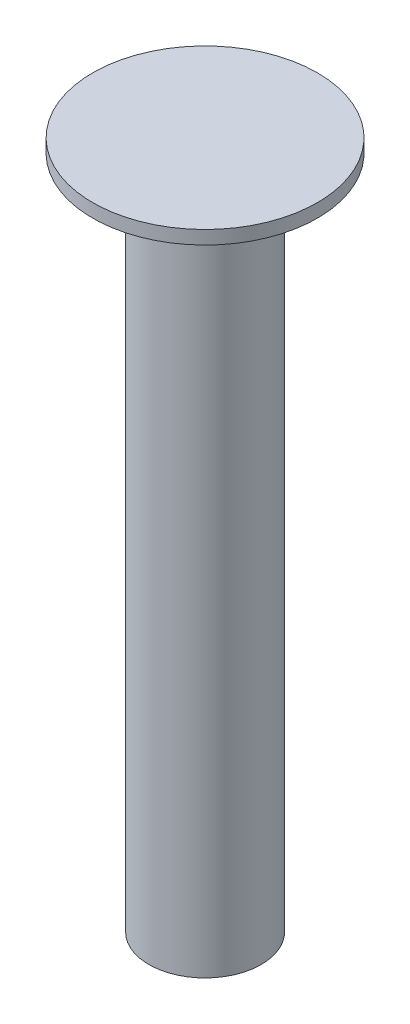
ISO-10303-21;
HEADER;
FILE_DESCRIPTION(('STEP AP214'),'2;1');
FILE_NAME('part.step','',(''),(''),'','','');
FILE_SCHEMA(('AUTOMOTIVE_DESIGN { 1 0 10303 214 1 1 1 1 }'));
ENDSEC;
DATA;
#1=APPLICATION_CONTEXT('core data for automotive mechanical design processes');
#2=APPLICATION_PROTOCOL_DEFINITION('international standard','automotive_design',2000,#1);
#3=PRODUCT_CONTEXT('',#1,'mechanical');
#4=PRODUCT('Part','Part','',(#3));
#5=PRODUCT_RELATED_PRODUCT_CATEGORY('part','',(#4));
#6=PRODUCT_DEFINITION_FORMATION('','',#4);
#7=PRODUCT_DEFINITION_CONTEXT('part definition',#1,'design');
#8=PRODUCT_DEFINITION('design','',#6,#7);
#9=PRODUCT_DEFINITION_SHAPE('','',#8);
#10=(LENGTH_UNIT() NAMED_UNIT(*) SI_UNIT(.MILLI.,.METRE.));
#11=(NAMED_UNIT(*) PLANE_ANGLE_UNIT() SI_UNIT($,.RADIAN.));
#12=(NAMED_UNIT(*) SI_UNIT($,.STERADIAN.) SOLID_ANGLE_UNIT());
#13=UNCERTAINTY_MEASURE_WITH_UNIT(LENGTH_MEASURE(1.E-05),#10,'distance_accuracy_value','');
#14=(GEOMETRIC_REPRESENTATION_CONTEXT(3) GLOBAL_UNCERTAINTY_ASSIGNED_CONTEXT((#13)) GLOBAL_UNIT_ASSIGNED_CONTEXT((#10,
#11,#12)) REPRESENTATION_CONTEXT('',''));
#15=CARTESIAN_POINT('',(0.,0.,0.));
#16=DIRECTION('',(0.,0.,1.));
#17=DIRECTION('',(1.,0.,0.));
#18=AXIS2_PLACEMENT_3D('',#15,#16,#17);
#19=CARTESIAN_POINT('',(0.,76.2,0.));
#20=DIRECTION('',(0.,-1.,0.));
#21=DIRECTION('',(0.,0.,-1.));
#22=AXIS2_PLACEMENT_3D('',#19,#20,#21);
#23=CYLINDRICAL_SURFACE('',#22,6.35);
#24=CARTESIAN_POINT('',(0.,76.2,0.));
#25=DIRECTION('',(0.,1.,0.));
#26=DIRECTION('',(0.,0.,1.));
#27=AXIS2_PLACEMENT_3D('',#24,#25,#26);
#28=CIRCLE('',#27,6.35);
#29=CARTESIAN_POINT('',(0.,76.2,-6.35));
#30=VERTEX_POINT('',#29);
#31=EDGE_CURVE('E10',#30,#30,#28,.T.);
#32=CARTESIAN_POINT('',(0.,0.,0.));
#33=DIRECTION('',(0.,1.,0.));
#34=DIRECTION('',(0.,0.,1.));
#35=AXIS2_PLACEMENT_3D('',#32,#33,#34);
#36=CIRCLE('',#35,6.35);
#37=CARTESIAN_POINT('',(0.,0.,-6.35));
#38=VERTEX_POINT('',#37);
#39=EDGE_CURVE('E48',#38,#38,#36,.T.);
#40=CARTESIAN_POINT('',(0.,76.2,-6.35));
#41=CARTESIAN_POINT('',(0.,75.40625,-6.35));
#42=CARTESIAN_POINT('',(0.,74.6125,-6.35));
#43=CARTESIAN_POINT('',(0.,73.025,-6.35));
#44=CARTESIAN_POINT('',(0.,72.23125,-6.35));
#45=CARTESIAN_POINT('',(0.,70.64375,-6.35));
#46=CARTESIAN_POINT('',(0.,69.85,-6.35));
#47=CARTESIAN_POINT('',(0.,68.2625,-6.35));
#48=CARTESIAN_POINT('',(0.,67.46875,-6.35));
#49=CARTESIAN_POINT('',(0.,65.88125,-6.35));
#50=CARTESIAN_POINT('',(0.,65.0875,-6.35));
#51=CARTESIAN_POINT('',(0.,63.5,-6.35));
#52=CARTESIAN_POINT('',(0.,62.70625,-6.35));
#53=CARTESIAN_POINT('',(0.,61.11875,-6.35));
#54=CARTESIAN_POINT('',(0.,60.325,-6.35));
#55=CARTESIAN_POINT('',(0.,58.7375,-6.35));
#56=CARTESIAN_POINT('',(0.,57.94375,-6.35));
#57=CARTESIAN_POINT('',(0.,56.35625,-6.35));
#58=CARTESIAN_POINT('',(0.,55.5625,-6.35));
#59=CARTESIAN_POINT('',(0.,53.975,-6.35));
#60=CARTESIAN_POINT('',(0.,53.18125,-6.35));
#61=CARTESIAN_POINT('',(0.,51.59375,-6.35));
#62=CARTESIAN_POINT('',(0.,50.8,-6.35));
#63=CARTESIAN_POINT('',(0.,49.2125,-6.35));
#64=CARTESIAN_POINT('',(0.,48.41875,-6.35));
#65=CARTESIAN_POINT('',(0.,46.83125,-6.35));
#66=CARTESIAN_POINT('',(0.,46.0375,-6.35));
#67=CARTESIAN_POINT('',(0.,44.45,-6.35));
#68=CARTESIAN_POINT('',(0.,43.65625,-6.35));
#69=CARTESIAN_POINT('',(0.,42.06875,-6.35));
#70=CARTESIAN_POINT('',(0.,41.275,-6.35));
#71=CARTESIAN_POINT('',(0.,39.6875,-6.35));
#72=CARTESIAN_POINT('',(0.,38.89375,-6.35));
#73=CARTESIAN_POINT('',(0.,37.30625,-6.35));
#74=CARTESIAN_POINT('',(0.,36.5125,-6.35));
#75=CARTESIAN_POINT('',(0.,34.925,-6.35));
#76=CARTESIAN_POINT('',(0.,34.13125,-6.35));
#77=CARTESIAN_POINT('',(0.,32.54375,-6.35));
#78=CARTESIAN_POINT('',(0.,31.75,-6.35));
#79=CARTESIAN_POINT('',(0.,30.1625,-6.35));
#80=CARTESIAN_POINT('',(0.,29.36875,-6.35));
#81=CARTESIAN_POINT('',(0.,27.78125,-6.35));
#82=CARTESIAN_POINT('',(0.,26.9875,-6.35));
#83=CARTESIAN_POINT('',(0.,25.4,-6.35));
#84=CARTESIAN_POINT('',(0.,24.60625,-6.35));
#85=CARTESIAN_POINT('',(0.,23.01875,-6.35));
#86=CARTESIAN_POINT('',(0.,22.225,-6.35));
#87=CARTESIAN_POINT('',(0.,20.6375,-6.35));
#88=CARTESIAN_POINT('',(0.,19.84375,-6.35));
#89=CARTESIAN_POINT('',(0.,18.25625,-6.35));
#90=CARTESIAN_POINT('',(0.,17.4625,-6.35));
#91=CARTESIAN_POINT('',(0.,15.875,-6.35));
#92=CARTESIAN_POINT('',(0.,15.08125,-6.35));
#93=CARTESIAN_POINT('',(0.,13.49375,-6.35));
#94=CARTESIAN_POINT('',(0.,12.7,-6.35));
#95=CARTESIAN_POINT('',(0.,11.1125,-6.35));
#96=CARTESIAN_POINT('',(0.,10.31875,-6.35));
#97=CARTESIAN_POINT('',(0.,8.73125,-6.35));
#98=CARTESIAN_POINT('',(0.,7.93750000000001,-6.35));
#99=CARTESIAN_POINT('',(0.,6.35,-6.35));
#100=CARTESIAN_POINT('',(0.,5.55625,-6.35));
#101=CARTESIAN_POINT('',(0.,3.96875,-6.35));
#102=CARTESIAN_POINT('',(0.,3.175,-6.35));
#103=CARTESIAN_POINT('',(0.,1.5875,-6.35));
#104=CARTESIAN_POINT('',(0.,0.793750000000001,-6.35));
#105=CARTESIAN_POINT('',(0.,0.,-6.35));
#106=B_SPLINE_CURVE_WITH_KNOTS('',3,(#40,#41,#42,#43,#44,#45,#46,#47,#48,#49,#50,#51,#52,#53,
#54,#55,#56,#57,#58,#59,#60,#61,#62,#63,#64,#65,#66,#67,#68,#69,#70,#71,#72,#73,#74,#75,#76,#77,
#78,#79,#80,#81,#82,#83,#84,#85,#86,#87,#88,#89,#90,#91,#92,#93,#94,#95,#96,#97,#98,#99,#100,
#101,#102,#103,#104,#105),.UNSPECIFIED.,.F.,.F.,(4,2,2,2,2,2,2,2,2,2,2,2,2,2,2,2,2,2,2,2,2,2,2,
2,2,2,2,2,2,2,2,2,4),(0.,2.38124999999999,4.76249999999999,7.14374999999999,9.52499999999999,
11.90625,14.2875,16.66875,19.05,21.43125,23.8125,26.19375,28.575,30.95625,33.3375,35.71875,38.1,
40.48125,42.8625,45.24375,47.625,50.00625,52.3875,54.76875,57.15,59.53125,61.9125,64.29375,
66.675,69.05625,71.4375,73.81875,76.2),.UNSPECIFIED.);
#107=EDGE_CURVE('BSEAM45',#30,#38,#106,.T.);
#108=ORIENTED_EDGE('',*,*,#31,.F.);
#109=ORIENTED_EDGE('',*,*,#39,.T.);
#110=ORIENTED_EDGE('',*,*,#107,.T.);
#111=ORIENTED_EDGE('',*,*,#107,.F.);
#112=EDGE_LOOP('',(#108,#110,#109,#111));
#113=FACE_BOUND('',#112,.T.);
#114=ADVANCED_FACE('F45',(#113),#23,.T.);
#115=CARTESIAN_POINT('',(0.,0.,0.));
#116=DIRECTION('',(0.,1.,0.));
#117=DIRECTION('',(0.,0.,1.));
#118=AXIS2_PLACEMENT_3D('',#115,#116,#117);
#119=PLANE('',#118);
#120=ORIENTED_EDGE('',*,*,#39,.F.);
#121=EDGE_LOOP('',(#120));
#122=FACE_BOUND('',#121,.T.);
#123=ADVANCED_FACE('F74',(#122),#119,.F.);
#124=CARTESIAN_POINT('',(0.,77.724,0.));
#125=DIRECTION('',(0.,-1.,0.));
#126=DIRECTION('',(0.,0.,-1.));
#127=AXIS2_PLACEMENT_3D('',#124,#125,#126);
#128=CYLINDRICAL_SURFACE('',#127,12.7);
#129=CARTESIAN_POINT('',(0.,77.724,0.));
#130=DIRECTION('',(0.,1.,0.));
#131=DIRECTION('',(0.,0.,1.));
#132=AXIS2_PLACEMENT_3D('',#129,#130,#131);
#133=CIRCLE('',#132,12.7);
#134=CARTESIAN_POINT('',(0.,77.724,-12.7));
#135=VERTEX_POINT('',#134);
#136=EDGE_CURVE('E58',#135,#135,#133,.T.);
#137=CARTESIAN_POINT('',(0.,76.2,0.));
#138=DIRECTION('',(0.,1.,0.));
#139=DIRECTION('',(0.,0.,1.));
#140=AXIS2_PLACEMENT_3D('',#137,#138,#139);
#141=CIRCLE('',#140,12.7);
#142=CARTESIAN_POINT('',(0.,76.2,-12.7));
#143=VERTEX_POINT('',#142);
#144=EDGE_CURVE('E60',#143,#143,#141,.T.);
#145=CARTESIAN_POINT('',(0.,77.724,-12.7));
#146=CARTESIAN_POINT('',(0.,77.708125,-12.7));
#147=CARTESIAN_POINT('',(0.,77.69225,-12.7));
#148=CARTESIAN_POINT('',(0.,77.6605,-12.7));
#149=CARTESIAN_POINT('',(0.,77.644625,-12.7));
#150=CARTESIAN_POINT('',(0.,77.612875,-12.7));
#151=CARTESIAN_POINT('',(0.,77.597,-12.7));
#152=CARTESIAN_POINT('',(0.,77.56525,-12.7));
#153=CARTESIAN_POINT('',(0.,77.549375,-12.7));
#154=CARTESIAN_POINT('',(0.,77.517625,-12.7));
#155=CARTESIAN_POINT('',(0.,77.50175,-12.7));
#156=CARTESIAN_POINT('',(0.,77.47,-12.7));
#157=CARTESIAN_POINT('',(0.,77.454125,-12.7));
#158=CARTESIAN_POINT('',(0.,77.422375,-12.7));
#159=CARTESIAN_POINT('',(0.,77.4065,-12.7));
#160=CARTESIAN_POINT('',(0.,77.37475,-12.7));
#161=CARTESIAN_POINT('',(0.,77.358875,-12.7));
#162=CARTESIAN_POINT('',(0.,77.327125,-12.7));
#163=CARTESIAN_POINT('',(0.,77.31125,-12.7));
#164=CARTESIAN_POINT('',(0.,77.2795,-12.7));
#165=CARTESIAN_POINT('',(0.,77.263625,-12.7));
#166=CARTESIAN_POINT('',(0.,77.231875,-12.7));
#167=CARTESIAN_POINT('',(0.,77.216,-12.7));
#168=CARTESIAN_POINT('',(0.,77.18425,-12.7));
#169=CARTESIAN_POINT('',(0.,77.168375,-12.7));
#170=CARTESIAN_POINT('',(0.,77.136625,-12.7));
#171=CARTESIAN_POINT('',(0.,77.12075,-12.7));
#172=CARTESIAN_POINT('',(0.,77.089,-12.7));
#173=CARTESIAN_POINT('',(0.,77.073125,-12.7));
#174=CARTESIAN_POINT('',(0.,77.041375,-12.7));
#175=CARTESIAN_POINT('',(0.,77.0255,-12.7));
#176=CARTESIAN_POINT('',(0.,76.99375,-12.7));
#177=CARTESIAN_POINT('',(0.,76.977875,-12.7));
#178=CARTESIAN_POINT('',(0.,76.946125,-12.7));
#179=CARTESIAN_POINT('',(0.,76.93025,-12.7));
#180=CARTESIAN_POINT('',(0.,76.8985,-12.7));
#181=CARTESIAN_POINT('',(0.,76.882625,-12.7));
#182=CARTESIAN_POINT('',(0.,76.850875,-12.7));
#183=CARTESIAN_POINT('',(0.,76.835,-12.7));
#184=CARTESIAN_POINT('',(0.,76.80325,-12.7));
#185=CARTESIAN_POINT('',(0.,76.787375,-12.7));
#186=CARTESIAN_POINT('',(0.,76.755625,-12.7));
#187=CARTESIAN_POINT('',(0.,76.73975,-12.7));
#188=CARTESIAN_POINT('',(0.,76.708,-12.7));
#189=CARTESIAN_POINT('',(0.,76.692125,-12.7));
#190=CARTESIAN_POINT('',(0.,76.660375,-12.7));
#191=CARTESIAN_POINT('',(0.,76.6445,-12.7));
#192=CARTESIAN_POINT('',(0.,76.61275,-12.7));
#193=CARTESIAN_POINT('',(0.,76.596875,-12.7));
#194=CARTESIAN_POINT('',(0.,76.565125,-12.7));
#195=CARTESIAN_POINT('',(0.,76.54925,-12.7));
#196=CARTESIAN_POINT('',(0.,76.5175,-12.7));
#197=CARTESIAN_POINT('',(0.,76.501625,-12.7));
#198=CARTESIAN_POINT('',(0.,76.469875,-12.7));
#199=CARTESIAN_POINT('',(0.,76.454,-12.7));
#200=CARTESIAN_POINT('',(0.,76.42225,-12.7));
#201=CARTESIAN_POINT('',(0.,76.406375,-12.7));
#202=CARTESIAN_POINT('',(0.,76.374625,-12.7));
#203=CARTESIAN_POINT('',(0.,76.35875,-12.7));
#204=CARTESIAN_POINT('',(0.,76.327,-12.7));
#205=CARTESIAN_POINT('',(0.,76.311125,-12.7));
#206=CARTESIAN_POINT('',(0.,76.279375,-12.7));
#207=CARTESIAN_POINT('',(0.,76.2635,-12.7));
#208=CARTESIAN_POINT('',(0.,76.23175,-12.7));
#209=CARTESIAN_POINT('',(0.,76.215875,-12.7));
#210=CARTESIAN_POINT('',(0.,76.2,-12.7));
#211=B_SPLINE_CURVE_WITH_KNOTS('',3,(#145,#146,#147,#148,#149,#150,#151,#152,#153,#154,#155,
#156,#157,#158,#159,#160,#161,#162,#163,#164,#165,#166,#167,#168,#169,#170,#171,#172,#173,#174,
#175,#176,#177,#178,#179,#180,#181,#182,#183,#184,#185,#186,#187,#188,#189,#190,#191,#192,#193,
#194,#195,#196,#197,#198,#199,#200,#201,#202,#203,#204,#205,#206,#207,#208,#209,#210),
.UNSPECIFIED.,.F.,.F.,(4,2,2,2,2,2,2,2,2,2,2,2,2,2,2,2,2,2,2,2,2,2,2,2,2,2,2,2,2,2,2,2,4),(0.,
0.0476249999999956,0.0952499999999912,0.142874999999987,0.190499999999996,0.238124999999992,
0.285749999999987,0.333374999999997,0.380999999999992,0.428624999999988,0.476249999999998,
0.523874999999993,0.571499999999989,0.619124999999998,0.666749999999994,0.714374999999989,
0.761999999999985,0.809624999999994,0.85724999999999,0.904874999999986,0.952499999999995,
1.00012499999999,1.04774999999999,1.095375,1.14299999999999,1.19062499999999,1.23825,
1.28587499999999,1.33349999999999,1.381125,1.42874999999999,1.47637499999999,1.52399999999998),.UNSPECIFIED.);
#212=EDGE_CURVE('BSEAM71',#135,#143,#211,.T.);
#213=ORIENTED_EDGE('',*,*,#136,.F.);
#214=ORIENTED_EDGE('',*,*,#144,.T.);
#215=ORIENTED_EDGE('',*,*,#212,.T.);
#216=ORIENTED_EDGE('',*,*,#212,.F.);
#217=EDGE_LOOP('',(#213,#215,#214,#216));
#218=FACE_BOUND('',#217,.T.);
#219=ADVANCED_FACE('F71',(#218),#128,.T.);
#220=CARTESIAN_POINT('',(0.,77.724,0.));
#221=DIRECTION('',(0.,1.,0.));
#222=DIRECTION('',(0.,0.,1.));
#223=AXIS2_PLACEMENT_3D('',#220,#221,#222);
#224=PLANE('',#223);
#225=ORIENTED_EDGE('',*,*,#136,.T.);
#226=EDGE_LOOP('',(#225));
#227=FACE_BOUND('',#226,.T.);
#228=ADVANCED_FACE('F69',(#227),#224,.T.);
#229=CARTESIAN_POINT('',(0.,76.2,0.));
#230=DIRECTION('',(0.,1.,0.));
#231=DIRECTION('',(0.,0.,1.));
#232=AXIS2_PLACEMENT_3D('',#229,#230,#231);
#233=PLANE('',#232);
#234=ORIENTED_EDGE('',*,*,#31,.T.);
#235=EDGE_LOOP('',(#234));
#236=FACE_BOUND('',#235,.T.);
#237=ORIENTED_EDGE('',*,*,#144,.F.);
#238=EDGE_LOOP('',(#237));
#239=FACE_BOUND('',#238,.T.);
#240=ADVANCED_FACE('F78',(#236,#239),#233,.F.);
#241=CLOSED_SHELL('',(#114,#123,#219,#228,#240));
#242=MANIFOLD_SOLID_BREP('B2',#241);
#243=ADVANCED_BREP_SHAPE_REPRESENTATION('',(#18,#242),#14);
#244=SHAPE_DEFINITION_REPRESENTATION(#9,#243);
ENDSEC;
END-ISO-10303-21;
